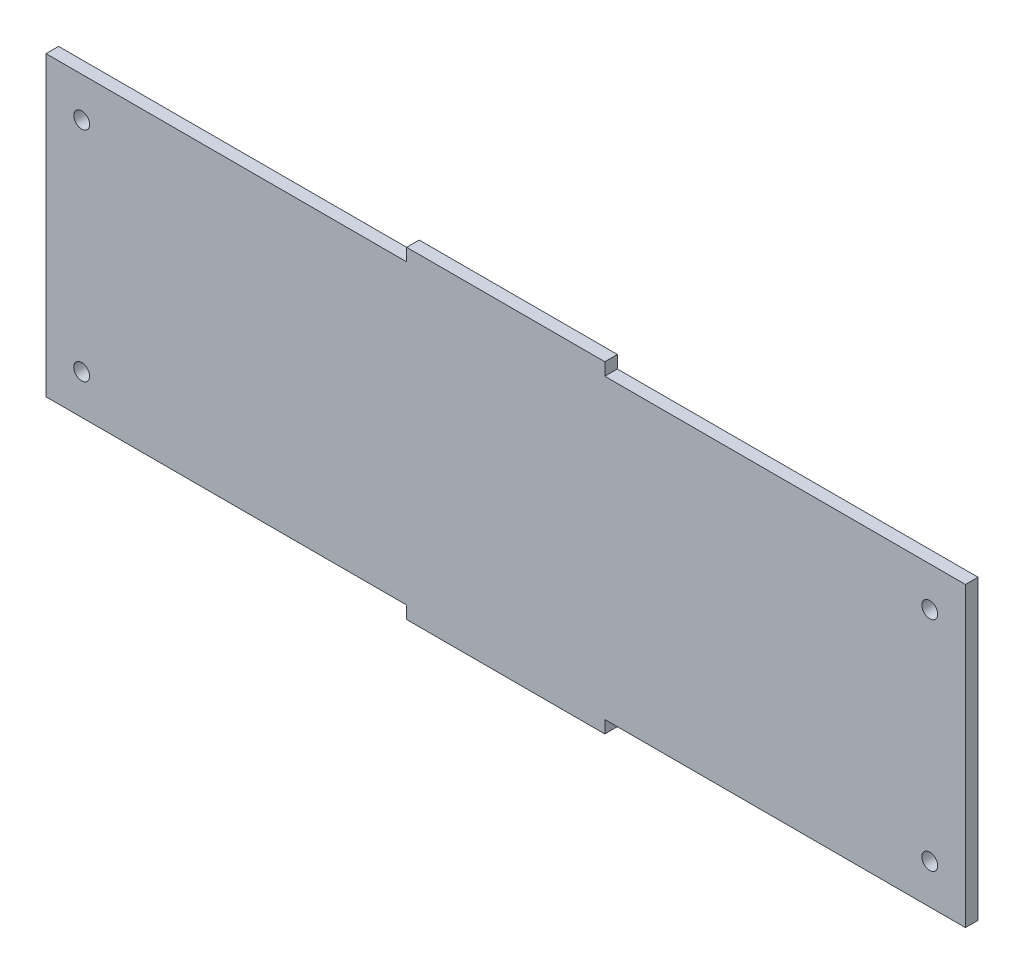
ISO-10303-21;
HEADER;
FILE_DESCRIPTION(('STEP AP214'),'2;1');
FILE_NAME('part.step','',(''),(''),'','','');
FILE_SCHEMA(('AUTOMOTIVE_DESIGN { 1 0 10303 214 1 1 1 1 }'));
ENDSEC;
DATA;
#1=APPLICATION_CONTEXT('core data for automotive mechanical design processes');
#2=APPLICATION_PROTOCOL_DEFINITION('international standard','automotive_design',2000,#1);
#3=PRODUCT_CONTEXT('',#1,'mechanical');
#4=PRODUCT('Part','Part','',(#3));
#5=PRODUCT_RELATED_PRODUCT_CATEGORY('part','',(#4));
#6=PRODUCT_DEFINITION_FORMATION('','',#4);
#7=PRODUCT_DEFINITION_CONTEXT('part definition',#1,'design');
#8=PRODUCT_DEFINITION('design','',#6,#7);
#9=PRODUCT_DEFINITION_SHAPE('','',#8);
#10=(LENGTH_UNIT() NAMED_UNIT(*) SI_UNIT(.MILLI.,.METRE.));
#11=(NAMED_UNIT(*) PLANE_ANGLE_UNIT() SI_UNIT($,.RADIAN.));
#12=(NAMED_UNIT(*) SI_UNIT($,.STERADIAN.) SOLID_ANGLE_UNIT());
#13=UNCERTAINTY_MEASURE_WITH_UNIT(LENGTH_MEASURE(1.E-05),#10,'distance_accuracy_value','');
#14=(GEOMETRIC_REPRESENTATION_CONTEXT(3) GLOBAL_UNCERTAINTY_ASSIGNED_CONTEXT((#13)) GLOBAL_UNIT_ASSIGNED_CONTEXT((#10,
#11,#12)) REPRESENTATION_CONTEXT('',''));
#15=CARTESIAN_POINT('',(0.,0.,0.));
#16=DIRECTION('',(0.,0.,1.));
#17=DIRECTION('',(1.,0.,0.));
#18=AXIS2_PLACEMENT_3D('',#15,#16,#17);
#19=CARTESIAN_POINT('',(0.,75.,3.175));
#20=DIRECTION('',(0.,-1.,0.));
#21=DIRECTION('',(0.,0.,-1.));
#22=AXIS2_PLACEMENT_3D('',#19,#20,#21);
#23=PLANE('',#22);
#24=DIRECTION('',(0.,0.,1.));
#25=VECTOR('',#24,1.);
#26=CARTESIAN_POINT('',(91.,75.,-50.1007048353614));
#27=LINE('',#26,#25);
#28=CARTESIAN_POINT('',(91.,75.,0.));
#29=VERTEX_POINT('',#28);
#30=CARTESIAN_POINT('',(91.,75.,3.175));
#31=VERTEX_POINT('',#30);
#32=EDGE_CURVE('E131',#29,#31,#27,.T.);
#33=ORIENTED_EDGE('',*,*,#32,.F.);
#34=DIRECTION('',(-1.,0.,0.));
#35=VECTOR('',#34,1.);
#36=CARTESIAN_POINT('',(0.,75.,0.));
#37=LINE('',#36,#35);
#38=CARTESIAN_POINT('',(0.,75.,0.));
#39=VERTEX_POINT('',#38);
#40=EDGE_CURVE('E141',#29,#39,#37,.T.);
#41=ORIENTED_EDGE('',*,*,#40,.T.);
#42=DIRECTION('',(0.,0.,-1.));
#43=VECTOR('',#42,1.);
#44=CARTESIAN_POINT('',(0.,75.,3.175));
#45=LINE('',#44,#43);
#46=CARTESIAN_POINT('',(0.,75.,3.175));
#47=VERTEX_POINT('',#46);
#48=EDGE_CURVE('E159',#47,#39,#45,.T.);
#49=ORIENTED_EDGE('',*,*,#48,.F.);
#50=DIRECTION('',(-1.,0.,0.));
#51=VECTOR('',#50,1.);
#52=CARTESIAN_POINT('',(0.,75.,3.175));
#53=LINE('',#52,#51);
#54=EDGE_CURVE('E143',#31,#47,#53,.T.);
#55=ORIENTED_EDGE('',*,*,#54,.F.);
#56=EDGE_LOOP('',(#33,#41,#49,#55));
#57=FACE_BOUND('',#56,.T.);
#58=ADVANCED_FACE('F37',(#57),#23,.F.);
#59=CARTESIAN_POINT('',(0.,0.,3.175));
#60=DIRECTION('',(0.,1.,0.));
#61=DIRECTION('',(-1.,0.,0.));
#62=AXIS2_PLACEMENT_3D('',#59,#60,#61);
#63=PLANE('',#62);
#64=DIRECTION('',(0.,0.,1.));
#65=VECTOR('',#64,1.);
#66=CARTESIAN_POINT('',(141.,0.,-50.1007048353614));
#67=LINE('',#66,#65);
#68=CARTESIAN_POINT('',(141.,0.,0.));
#69=VERTEX_POINT('',#68);
#70=CARTESIAN_POINT('',(141.,0.,3.175));
#71=VERTEX_POINT('',#70);
#72=EDGE_CURVE('E194',#69,#71,#67,.T.);
#73=ORIENTED_EDGE('',*,*,#72,.F.);
#74=DIRECTION('',(1.,0.,0.));
#75=VECTOR('',#74,1.);
#76=CARTESIAN_POINT('',(0.,0.,0.));
#77=LINE('',#76,#75);
#78=CARTESIAN_POINT('',(232.,0.,0.));
#79=VERTEX_POINT('',#78);
#80=EDGE_CURVE('E176',#69,#79,#77,.T.);
#81=ORIENTED_EDGE('',*,*,#80,.T.);
#82=DIRECTION('',(0.,0.,-1.));
#83=VECTOR('',#82,1.);
#84=CARTESIAN_POINT('',(232.,0.,3.175));
#85=LINE('',#84,#83);
#86=CARTESIAN_POINT('',(232.,0.,3.175));
#87=VERTEX_POINT('',#86);
#88=EDGE_CURVE('E45',#87,#79,#85,.T.);
#89=ORIENTED_EDGE('',*,*,#88,.F.);
#90=DIRECTION('',(1.,0.,0.));
#91=VECTOR('',#90,1.);
#92=CARTESIAN_POINT('',(0.,0.,3.175));
#93=LINE('',#92,#91);
#94=EDGE_CURVE('E195',#71,#87,#93,.T.);
#95=ORIENTED_EDGE('',*,*,#94,.F.);
#96=EDGE_LOOP('',(#73,#81,#89,#95));
#97=FACE_BOUND('',#96,.T.);
#98=ADVANCED_FACE('F193',(#97),#63,.F.);
#99=CARTESIAN_POINT('',(0.,0.,3.175));
#100=DIRECTION('',(0.,0.,-1.));
#101=DIRECTION('',(-1.,0.,0.));
#102=AXIS2_PLACEMENT_3D('',#99,#100,#101);
#103=PLANE('',#102);
#104=DIRECTION('',(0.,-1.,0.));
#105=VECTOR('',#104,1.);
#106=CARTESIAN_POINT('',(0.,0.,3.175));
#107=LINE('',#106,#105);
#108=CARTESIAN_POINT('',(0.,0.,3.175));
#109=VERTEX_POINT('',#108);
#110=EDGE_CURVE('E154',#47,#109,#107,.T.);
#111=ORIENTED_EDGE('',*,*,#110,.T.);
#112=CARTESIAN_POINT('',(91.,0.,3.175));
#113=VERTEX_POINT('',#112);
#114=EDGE_CURVE('E235',#109,#113,#93,.T.);
#115=ORIENTED_EDGE('',*,*,#114,.T.);
#116=DIRECTION('',(0.,-1.,0.));
#117=VECTOR('',#116,1.);
#118=CARTESIAN_POINT('',(91.,0.,3.175));
#119=LINE('',#118,#117);
#120=CARTESIAN_POINT('',(91.,-3.175,3.175));
#121=VERTEX_POINT('',#120);
#122=EDGE_CURVE('E60',#113,#121,#119,.T.);
#123=ORIENTED_EDGE('',*,*,#122,.T.);
#124=DIRECTION('',(1.,0.,0.));
#125=VECTOR('',#124,1.);
#126=CARTESIAN_POINT('',(91.,-3.175,3.175));
#127=LINE('',#126,#125);
#128=CARTESIAN_POINT('',(141.,-3.175,3.175));
#129=VERTEX_POINT('',#128);
#130=EDGE_CURVE('E242',#121,#129,#127,.T.);
#131=ORIENTED_EDGE('',*,*,#130,.T.);
#132=DIRECTION('',(0.,1.,0.));
#133=VECTOR('',#132,1.);
#134=CARTESIAN_POINT('',(141.,0.,3.175));
#135=LINE('',#134,#133);
#136=EDGE_CURVE('E240',#129,#71,#135,.T.);
#137=ORIENTED_EDGE('',*,*,#136,.T.);
#138=ORIENTED_EDGE('',*,*,#94,.T.);
#139=DIRECTION('',(0.,1.,0.));
#140=VECTOR('',#139,1.);
#141=CARTESIAN_POINT('',(232.,0.,3.175));
#142=LINE('',#141,#140);
#143=CARTESIAN_POINT('',(232.,75.,3.175));
#144=VERTEX_POINT('',#143);
#145=EDGE_CURVE('E171',#87,#144,#142,.T.);
#146=ORIENTED_EDGE('',*,*,#145,.T.);
#147=CARTESIAN_POINT('',(141.,75.,3.175));
#148=VERTEX_POINT('',#147);
#149=EDGE_CURVE('E162',#144,#148,#53,.T.);
#150=ORIENTED_EDGE('',*,*,#149,.T.);
#151=DIRECTION('',(0.,1.,0.));
#152=VECTOR('',#151,1.);
#153=CARTESIAN_POINT('',(141.,75.,3.175));
#154=LINE('',#153,#152);
#155=CARTESIAN_POINT('',(141.,78.175,3.175));
#156=VERTEX_POINT('',#155);
#157=EDGE_CURVE('E52',#148,#156,#154,.T.);
#158=ORIENTED_EDGE('',*,*,#157,.T.);
#159=DIRECTION('',(-1.,0.,0.));
#160=VECTOR('',#159,1.);
#161=CARTESIAN_POINT('',(91.,78.175,3.175));
#162=LINE('',#161,#160);
#163=CARTESIAN_POINT('',(91.,78.175,3.175));
#164=VERTEX_POINT('',#163);
#165=EDGE_CURVE('E249',#156,#164,#162,.T.);
#166=ORIENTED_EDGE('',*,*,#165,.T.);
#167=DIRECTION('',(0.,-1.,0.));
#168=VECTOR('',#167,1.);
#169=CARTESIAN_POINT('',(91.,75.,3.175));
#170=LINE('',#169,#168);
#171=EDGE_CURVE('E252',#164,#31,#170,.T.);
#172=ORIENTED_EDGE('',*,*,#171,.T.);
#173=ORIENTED_EDGE('',*,*,#54,.T.);
#174=EDGE_LOOP('',(#111,#115,#123,#131,#137,#138,#146,#150,#158,#166,#172,#173));
#175=FACE_BOUND('',#174,.T.);
#176=CARTESIAN_POINT('',(9.,65.,3.175));
#177=DIRECTION('',(0.,0.,1.));
#178=DIRECTION('',(1.,0.,0.));
#179=AXIS2_PLACEMENT_3D('',#176,#177,#178);
#180=CIRCLE('',#179,2.);
#181=CARTESIAN_POINT('',(11.,65.,3.175));
#182=VERTEX_POINT('',#181);
#183=EDGE_CURVE('E189',#182,#182,#180,.T.);
#184=ORIENTED_EDGE('',*,*,#183,.F.);
#185=EDGE_LOOP('',(#184));
#186=FACE_BOUND('',#185,.T.);
#187=CARTESIAN_POINT('',(9.,10.,3.175));
#188=DIRECTION('',(0.,0.,1.));
#189=DIRECTION('',(-1.,0.,0.));
#190=AXIS2_PLACEMENT_3D('',#187,#188,#189);
#191=CIRCLE('',#190,2.);
#192=CARTESIAN_POINT('',(7.,10.,3.175));
#193=VERTEX_POINT('',#192);
#194=EDGE_CURVE('E224',#193,#193,#191,.T.);
#195=ORIENTED_EDGE('',*,*,#194,.F.);
#196=EDGE_LOOP('',(#195));
#197=FACE_BOUND('',#196,.T.);
#198=CARTESIAN_POINT('',(223.,9.99999999999999,3.175));
#199=DIRECTION('',(0.,0.,1.));
#200=DIRECTION('',(1.,0.,0.));
#201=AXIS2_PLACEMENT_3D('',#198,#199,#200);
#202=CIRCLE('',#201,2.00000000000003);
#203=CARTESIAN_POINT('',(225.,9.99999999999999,3.175));
#204=VERTEX_POINT('',#203);
#205=EDGE_CURVE('E218',#204,#204,#202,.T.);
#206=ORIENTED_EDGE('',*,*,#205,.F.);
#207=EDGE_LOOP('',(#206));
#208=FACE_BOUND('',#207,.T.);
#209=CARTESIAN_POINT('',(223.,65.,3.175));
#210=DIRECTION('',(0.,0.,1.));
#211=DIRECTION('',(-1.,0.,0.));
#212=AXIS2_PLACEMENT_3D('',#209,#210,#211);
#213=CIRCLE('',#212,2.00000000000003);
#214=CARTESIAN_POINT('',(221.,65.,3.175));
#215=VERTEX_POINT('',#214);
#216=EDGE_CURVE('E212',#215,#215,#213,.T.);
#217=ORIENTED_EDGE('',*,*,#216,.F.);
#218=EDGE_LOOP('',(#217));
#219=FACE_BOUND('',#218,.T.);
#220=ADVANCED_FACE('F237',(#175,#186,#197,#208,#219),#103,.F.);
#221=CARTESIAN_POINT('',(0.,0.,0.));
#222=DIRECTION('',(0.,0.,-1.));
#223=DIRECTION('',(-1.,0.,0.));
#224=AXIS2_PLACEMENT_3D('',#221,#222,#223);
#225=PLANE('',#224);
#226=CARTESIAN_POINT('',(223.,9.99999999999999,0.));
#227=DIRECTION('',(0.,0.,1.));
#228=DIRECTION('',(1.,0.,0.));
#229=AXIS2_PLACEMENT_3D('',#226,#227,#228);
#230=CIRCLE('',#229,2.00000000000003);
#231=CARTESIAN_POINT('',(225.,9.99999999999999,0.));
#232=VERTEX_POINT('',#231);
#233=EDGE_CURVE('E215',#232,#232,#230,.T.);
#234=ORIENTED_EDGE('',*,*,#233,.T.);
#235=EDGE_LOOP('',(#234));
#236=FACE_BOUND('',#235,.T.);
#237=CARTESIAN_POINT('',(9.,65.,0.));
#238=DIRECTION('',(0.,0.,1.));
#239=DIRECTION('',(1.,0.,0.));
#240=AXIS2_PLACEMENT_3D('',#237,#238,#239);
#241=CIRCLE('',#240,2.);
#242=CARTESIAN_POINT('',(11.,65.,0.));
#243=VERTEX_POINT('',#242);
#244=EDGE_CURVE('E227',#243,#243,#241,.T.);
#245=ORIENTED_EDGE('',*,*,#244,.T.);
#246=EDGE_LOOP('',(#245));
#247=FACE_BOUND('',#246,.T.);
#248=DIRECTION('',(0.,-1.,0.));
#249=VECTOR('',#248,1.);
#250=CARTESIAN_POINT('',(0.,0.,0.));
#251=LINE('',#250,#249);
#252=CARTESIAN_POINT('',(0.,0.,0.));
#253=VERTEX_POINT('',#252);
#254=EDGE_CURVE('E149',#39,#253,#251,.T.);
#255=ORIENTED_EDGE('',*,*,#254,.F.);
#256=ORIENTED_EDGE('',*,*,#40,.F.);
#257=DIRECTION('',(0.,-1.,0.));
#258=VECTOR('',#257,1.);
#259=CARTESIAN_POINT('',(91.,75.,0.));
#260=LINE('',#259,#258);
#261=CARTESIAN_POINT('',(91.,78.175,0.));
#262=VERTEX_POINT('',#261);
#263=EDGE_CURVE('E127',#262,#29,#260,.T.);
#264=ORIENTED_EDGE('',*,*,#263,.F.);
#265=DIRECTION('',(-1.,0.,0.));
#266=VECTOR('',#265,1.);
#267=CARTESIAN_POINT('',(91.,78.175,0.));
#268=LINE('',#267,#266);
#269=CARTESIAN_POINT('',(141.,78.175,0.));
#270=VERTEX_POINT('',#269);
#271=EDGE_CURVE('E307',#270,#262,#268,.T.);
#272=ORIENTED_EDGE('',*,*,#271,.F.);
#273=DIRECTION('',(0.,1.,0.));
#274=VECTOR('',#273,1.);
#275=CARTESIAN_POINT('',(141.,75.,0.));
#276=LINE('',#275,#274);
#277=CARTESIAN_POINT('',(141.,75.,0.));
#278=VERTEX_POINT('',#277);
#279=EDGE_CURVE('E178',#278,#270,#276,.T.);
#280=ORIENTED_EDGE('',*,*,#279,.F.);
#281=CARTESIAN_POINT('',(232.,75.,0.));
#282=VERTEX_POINT('',#281);
#283=EDGE_CURVE('E150',#282,#278,#37,.T.);
#284=ORIENTED_EDGE('',*,*,#283,.F.);
#285=DIRECTION('',(0.,1.,0.));
#286=VECTOR('',#285,1.);
#287=CARTESIAN_POINT('',(232.,0.,0.));
#288=LINE('',#287,#286);
#289=EDGE_CURVE('E151',#79,#282,#288,.T.);
#290=ORIENTED_EDGE('',*,*,#289,.F.);
#291=ORIENTED_EDGE('',*,*,#80,.F.);
#292=DIRECTION('',(0.,1.,0.));
#293=VECTOR('',#292,1.);
#294=CARTESIAN_POINT('',(141.,0.,0.));
#295=LINE('',#294,#293);
#296=CARTESIAN_POINT('',(141.,-3.175,0.));
#297=VERTEX_POINT('',#296);
#298=EDGE_CURVE('E200',#297,#69,#295,.T.);
#299=ORIENTED_EDGE('',*,*,#298,.F.);
#300=DIRECTION('',(1.,0.,0.));
#301=VECTOR('',#300,1.);
#302=CARTESIAN_POINT('',(91.,-3.175,0.));
#303=LINE('',#302,#301);
#304=CARTESIAN_POINT('',(91.,-3.175,0.));
#305=VERTEX_POINT('',#304);
#306=EDGE_CURVE('E208',#305,#297,#303,.T.);
#307=ORIENTED_EDGE('',*,*,#306,.F.);
#308=DIRECTION('',(0.,-1.,0.));
#309=VECTOR('',#308,1.);
#310=CARTESIAN_POINT('',(91.,0.,0.));
#311=LINE('',#310,#309);
#312=CARTESIAN_POINT('',(91.,0.,0.));
#313=VERTEX_POINT('',#312);
#314=EDGE_CURVE('E202',#313,#305,#311,.T.);
#315=ORIENTED_EDGE('',*,*,#314,.F.);
#316=EDGE_CURVE('E155',#253,#313,#77,.T.);
#317=ORIENTED_EDGE('',*,*,#316,.F.);
#318=EDGE_LOOP('',(#255,#256,#264,#272,#280,#284,#290,#291,#299,#307,#315,#317));
#319=FACE_BOUND('',#318,.T.);
#320=CARTESIAN_POINT('',(9.,10.,0.));
#321=DIRECTION('',(0.,0.,1.));
#322=DIRECTION('',(-1.,0.,0.));
#323=AXIS2_PLACEMENT_3D('',#320,#321,#322);
#324=CIRCLE('',#323,2.);
#325=CARTESIAN_POINT('',(7.,10.,0.));
#326=VERTEX_POINT('',#325);
#327=EDGE_CURVE('E221',#326,#326,#324,.T.);
#328=ORIENTED_EDGE('',*,*,#327,.T.);
#329=EDGE_LOOP('',(#328));
#330=FACE_BOUND('',#329,.T.);
#331=CARTESIAN_POINT('',(223.,65.,0.));
#332=DIRECTION('',(0.,0.,1.));
#333=DIRECTION('',(-1.,0.,0.));
#334=AXIS2_PLACEMENT_3D('',#331,#332,#333);
#335=CIRCLE('',#334,2.00000000000003);
#336=CARTESIAN_POINT('',(221.,65.,0.));
#337=VERTEX_POINT('',#336);
#338=EDGE_CURVE('E211',#337,#337,#335,.T.);
#339=ORIENTED_EDGE('',*,*,#338,.T.);
#340=EDGE_LOOP('',(#339));
#341=FACE_BOUND('',#340,.T.);
#342=ADVANCED_FACE('F146',(#236,#247,#319,#330,#341),#225,.T.);
#343=CARTESIAN_POINT('',(0.,0.,3.175));
#344=DIRECTION('',(1.,0.,0.));
#345=DIRECTION('',(0.,0.,-1.));
#346=AXIS2_PLACEMENT_3D('',#343,#344,#345);
#347=PLANE('',#346);
#348=ORIENTED_EDGE('',*,*,#254,.T.);
#349=DIRECTION('',(0.,0.,-1.));
#350=VECTOR('',#349,1.);
#351=CARTESIAN_POINT('',(0.,0.,3.175));
#352=LINE('',#351,#350);
#353=EDGE_CURVE('E11',#109,#253,#352,.T.);
#354=ORIENTED_EDGE('',*,*,#353,.F.);
#355=ORIENTED_EDGE('',*,*,#110,.F.);
#356=ORIENTED_EDGE('',*,*,#48,.T.);
#357=EDGE_LOOP('',(#348,#354,#355,#356));
#358=FACE_BOUND('',#357,.T.);
#359=ADVANCED_FACE('F39',(#358),#347,.F.);
#360=ORIENTED_EDGE('',*,*,#316,.T.);
#361=DIRECTION('',(0.,0.,1.));
#362=VECTOR('',#361,1.);
#363=CARTESIAN_POINT('',(91.,0.,-50.1007048353614));
#364=LINE('',#363,#362);
#365=EDGE_CURVE('E199',#313,#113,#364,.T.);
#366=ORIENTED_EDGE('',*,*,#365,.T.);
#367=ORIENTED_EDGE('',*,*,#114,.F.);
#368=ORIENTED_EDGE('',*,*,#353,.T.);
#369=EDGE_LOOP('',(#360,#366,#367,#368));
#370=FACE_BOUND('',#369,.T.);
#371=ADVANCED_FACE('F276',(#370),#63,.F.);
#372=CARTESIAN_POINT('',(232.,0.,3.175));
#373=DIRECTION('',(-1.,0.,0.));
#374=DIRECTION('',(0.,0.,1.));
#375=AXIS2_PLACEMENT_3D('',#372,#373,#374);
#376=PLANE('',#375);
#377=ORIENTED_EDGE('',*,*,#289,.T.);
#378=DIRECTION('',(0.,0.,-1.));
#379=VECTOR('',#378,1.);
#380=CARTESIAN_POINT('',(232.,75.,3.175));
#381=LINE('',#380,#379);
#382=EDGE_CURVE('E161',#144,#282,#381,.T.);
#383=ORIENTED_EDGE('',*,*,#382,.F.);
#384=ORIENTED_EDGE('',*,*,#145,.F.);
#385=ORIENTED_EDGE('',*,*,#88,.T.);
#386=EDGE_LOOP('',(#377,#383,#384,#385));
#387=FACE_BOUND('',#386,.T.);
#388=ADVANCED_FACE('F169',(#387),#376,.F.);
#389=ORIENTED_EDGE('',*,*,#283,.T.);
#390=DIRECTION('',(0.,0.,1.));
#391=VECTOR('',#390,1.);
#392=CARTESIAN_POINT('',(141.,75.,-50.1007048353614));
#393=LINE('',#392,#391);
#394=EDGE_CURVE('E182',#278,#148,#393,.T.);
#395=ORIENTED_EDGE('',*,*,#394,.T.);
#396=ORIENTED_EDGE('',*,*,#149,.F.);
#397=ORIENTED_EDGE('',*,*,#382,.T.);
#398=EDGE_LOOP('',(#389,#395,#396,#397));
#399=FACE_BOUND('',#398,.T.);
#400=ADVANCED_FACE('F180',(#399),#23,.F.);
#401=CARTESIAN_POINT('',(9.,65.,3.175));
#402=DIRECTION('',(0.,0.,-1.));
#403=DIRECTION('',(-1.,0.,0.));
#404=AXIS2_PLACEMENT_3D('',#401,#402,#403);
#405=CYLINDRICAL_SURFACE('',#404,2.);
#406=ORIENTED_EDGE('',*,*,#183,.T.);
#407=EDGE_LOOP('',(#406));
#408=FACE_BOUND('',#407,.T.);
#409=ORIENTED_EDGE('',*,*,#244,.F.);
#410=EDGE_LOOP('',(#409));
#411=FACE_BOUND('',#410,.T.);
#412=ADVANCED_FACE('F280',(#408,#411),#405,.F.);
#413=CARTESIAN_POINT('',(9.,10.,3.175));
#414=DIRECTION('',(0.,0.,-1.));
#415=DIRECTION('',(-1.,0.,0.));
#416=AXIS2_PLACEMENT_3D('',#413,#414,#415);
#417=CYLINDRICAL_SURFACE('',#416,2.);
#418=ORIENTED_EDGE('',*,*,#194,.T.);
#419=EDGE_LOOP('',(#418));
#420=FACE_BOUND('',#419,.T.);
#421=ORIENTED_EDGE('',*,*,#327,.F.);
#422=EDGE_LOOP('',(#421));
#423=FACE_BOUND('',#422,.T.);
#424=ADVANCED_FACE('F286',(#420,#423),#417,.F.);
#425=CARTESIAN_POINT('',(223.,9.99999999999999,3.175));
#426=DIRECTION('',(0.,0.,-1.));
#427=DIRECTION('',(-1.,0.,0.));
#428=AXIS2_PLACEMENT_3D('',#425,#426,#427);
#429=CYLINDRICAL_SURFACE('',#428,2.00000000000003);
#430=ORIENTED_EDGE('',*,*,#205,.T.);
#431=EDGE_LOOP('',(#430));
#432=FACE_BOUND('',#431,.T.);
#433=ORIENTED_EDGE('',*,*,#233,.F.);
#434=EDGE_LOOP('',(#433));
#435=FACE_BOUND('',#434,.T.);
#436=ADVANCED_FACE('F372',(#432,#435),#429,.F.);
#437=CARTESIAN_POINT('',(223.,65.,3.175));
#438=DIRECTION('',(0.,0.,-1.));
#439=DIRECTION('',(-1.,0.,0.));
#440=AXIS2_PLACEMENT_3D('',#437,#438,#439);
#441=CYLINDRICAL_SURFACE('',#440,2.00000000000003);
#442=ORIENTED_EDGE('',*,*,#216,.T.);
#443=EDGE_LOOP('',(#442));
#444=FACE_BOUND('',#443,.T.);
#445=ORIENTED_EDGE('',*,*,#338,.F.);
#446=EDGE_LOOP('',(#445));
#447=FACE_BOUND('',#446,.T.);
#448=ADVANCED_FACE('F268',(#444,#447),#441,.F.);
#449=CARTESIAN_POINT('',(91.,-3.175,-50.1007048353614));
#450=DIRECTION('',(0.,-1.,0.));
#451=DIRECTION('',(0.,0.,-1.));
#452=AXIS2_PLACEMENT_3D('',#449,#450,#451);
#453=PLANE('',#452);
#454=DIRECTION('',(0.,0.,1.));
#455=VECTOR('',#454,1.);
#456=CARTESIAN_POINT('',(91.,-3.175,-50.1007048353614));
#457=LINE('',#456,#455);
#458=EDGE_CURVE('E209',#305,#121,#457,.T.);
#459=ORIENTED_EDGE('',*,*,#458,.F.);
#460=ORIENTED_EDGE('',*,*,#306,.T.);
#461=DIRECTION('',(0.,0.,1.));
#462=VECTOR('',#461,1.);
#463=CARTESIAN_POINT('',(141.,-3.175,-50.1007048353614));
#464=LINE('',#463,#462);
#465=EDGE_CURVE('E204',#297,#129,#464,.T.);
#466=ORIENTED_EDGE('',*,*,#465,.T.);
#467=ORIENTED_EDGE('',*,*,#130,.F.);
#468=EDGE_LOOP('',(#459,#460,#466,#467));
#469=FACE_BOUND('',#468,.T.);
#470=ADVANCED_FACE('F258',(#469),#453,.T.);
#471=CARTESIAN_POINT('',(141.,0.,-50.1007048353614));
#472=DIRECTION('',(1.,0.,0.));
#473=DIRECTION('',(0.,0.,-1.));
#474=AXIS2_PLACEMENT_3D('',#471,#472,#473);
#475=PLANE('',#474);
#476=ORIENTED_EDGE('',*,*,#465,.F.);
#477=ORIENTED_EDGE('',*,*,#298,.T.);
#478=ORIENTED_EDGE('',*,*,#72,.T.);
#479=ORIENTED_EDGE('',*,*,#136,.F.);
#480=EDGE_LOOP('',(#476,#477,#478,#479));
#481=FACE_BOUND('',#480,.T.);
#482=ADVANCED_FACE('F259',(#481),#475,.T.);
#483=CARTESIAN_POINT('',(91.,0.,-50.1007048353614));
#484=DIRECTION('',(-1.,0.,0.));
#485=DIRECTION('',(0.,0.,1.));
#486=AXIS2_PLACEMENT_3D('',#483,#484,#485);
#487=PLANE('',#486);
#488=ORIENTED_EDGE('',*,*,#365,.F.);
#489=ORIENTED_EDGE('',*,*,#314,.T.);
#490=ORIENTED_EDGE('',*,*,#458,.T.);
#491=ORIENTED_EDGE('',*,*,#122,.F.);
#492=EDGE_LOOP('',(#488,#489,#490,#491));
#493=FACE_BOUND('',#492,.T.);
#494=ADVANCED_FACE('F256',(#493),#487,.T.);
#495=CARTESIAN_POINT('',(141.,75.,-50.1007048353614));
#496=DIRECTION('',(1.,0.,0.));
#497=DIRECTION('',(0.,0.,-1.));
#498=AXIS2_PLACEMENT_3D('',#495,#496,#497);
#499=PLANE('',#498);
#500=ORIENTED_EDGE('',*,*,#394,.F.);
#501=ORIENTED_EDGE('',*,*,#279,.T.);
#502=DIRECTION('',(0.,0.,1.));
#503=VECTOR('',#502,1.);
#504=CARTESIAN_POINT('',(141.,78.175,-50.1007048353614));
#505=LINE('',#504,#503);
#506=EDGE_CURVE('E309',#270,#156,#505,.T.);
#507=ORIENTED_EDGE('',*,*,#506,.T.);
#508=ORIENTED_EDGE('',*,*,#157,.F.);
#509=EDGE_LOOP('',(#500,#501,#507,#508));
#510=FACE_BOUND('',#509,.T.);
#511=ADVANCED_FACE('F266',(#510),#499,.T.);
#512=CARTESIAN_POINT('',(91.,78.175,-50.1007048353614));
#513=DIRECTION('',(0.,1.,0.));
#514=DIRECTION('',(0.,0.,1.));
#515=AXIS2_PLACEMENT_3D('',#512,#513,#514);
#516=PLANE('',#515);
#517=ORIENTED_EDGE('',*,*,#506,.F.);
#518=ORIENTED_EDGE('',*,*,#271,.T.);
#519=DIRECTION('',(0.,0.,1.));
#520=VECTOR('',#519,1.);
#521=CARTESIAN_POINT('',(91.,78.175,-50.1007048353614));
#522=LINE('',#521,#520);
#523=EDGE_CURVE('E133',#262,#164,#522,.T.);
#524=ORIENTED_EDGE('',*,*,#523,.T.);
#525=ORIENTED_EDGE('',*,*,#165,.F.);
#526=EDGE_LOOP('',(#517,#518,#524,#525));
#527=FACE_BOUND('',#526,.T.);
#528=ADVANCED_FACE('F315',(#527),#516,.T.);
#529=CARTESIAN_POINT('',(91.,75.,-50.1007048353614));
#530=DIRECTION('',(-1.,0.,0.));
#531=DIRECTION('',(0.,0.,1.));
#532=AXIS2_PLACEMENT_3D('',#529,#530,#531);
#533=PLANE('',#532);
#534=ORIENTED_EDGE('',*,*,#523,.F.);
#535=ORIENTED_EDGE('',*,*,#263,.T.);
#536=ORIENTED_EDGE('',*,*,#32,.T.);
#537=ORIENTED_EDGE('',*,*,#171,.F.);
#538=EDGE_LOOP('',(#534,#535,#536,#537));
#539=FACE_BOUND('',#538,.T.);
#540=ADVANCED_FACE('F129',(#539),#533,.T.);
#541=CLOSED_SHELL('',(#58,#98,#220,#342,#359,#371,#388,#400,#412,#424,#436,#448,#470,#482,#494,
#511,#528,#540));
#542=MANIFOLD_SOLID_BREP('B2',#541);
#543=ADVANCED_BREP_SHAPE_REPRESENTATION('',(#18,#542),#14);
#544=SHAPE_DEFINITION_REPRESENTATION(#9,#543);
ENDSEC;
END-ISO-10303-21;
